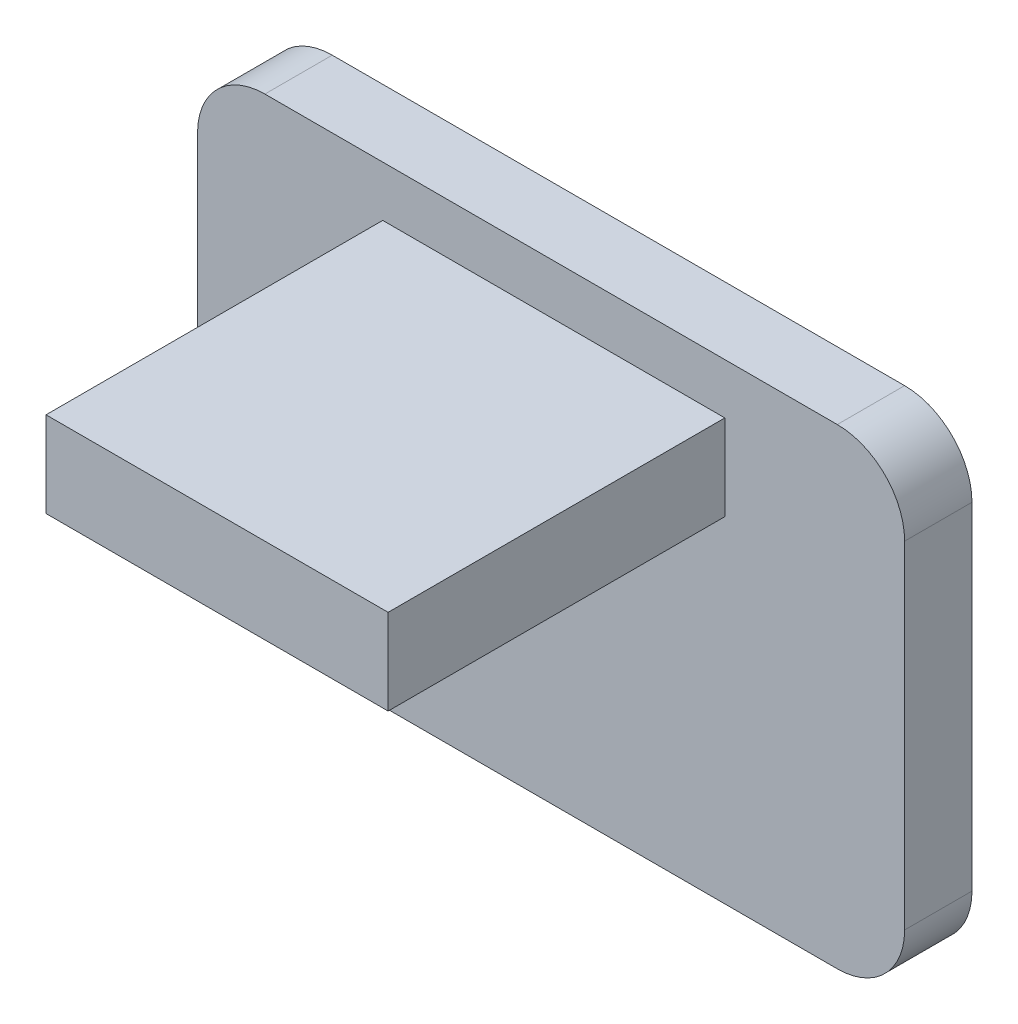
ISO-10303-21;
HEADER;
FILE_DESCRIPTION(('STEP AP214'),'2;1');
FILE_NAME('part.step','',(''),(''),'','','');
FILE_SCHEMA(('AUTOMOTIVE_DESIGN { 1 0 10303 214 1 1 1 1 }'));
ENDSEC;
DATA;
#1=APPLICATION_CONTEXT('core data for automotive mechanical design processes');
#2=APPLICATION_PROTOCOL_DEFINITION('international standard','automotive_design',2000,#1);
#3=PRODUCT_CONTEXT('',#1,'mechanical');
#4=PRODUCT('Part','Part','',(#3));
#5=PRODUCT_RELATED_PRODUCT_CATEGORY('part','',(#4));
#6=PRODUCT_DEFINITION_FORMATION('','',#4);
#7=PRODUCT_DEFINITION_CONTEXT('part definition',#1,'design');
#8=PRODUCT_DEFINITION('design','',#6,#7);
#9=PRODUCT_DEFINITION_SHAPE('','',#8);
#10=(LENGTH_UNIT() NAMED_UNIT(*) SI_UNIT(.MILLI.,.METRE.));
#11=(NAMED_UNIT(*) PLANE_ANGLE_UNIT() SI_UNIT($,.RADIAN.));
#12=(NAMED_UNIT(*) SI_UNIT($,.STERADIAN.) SOLID_ANGLE_UNIT());
#13=UNCERTAINTY_MEASURE_WITH_UNIT(LENGTH_MEASURE(1.E-05),#10,'distance_accuracy_value','');
#14=(GEOMETRIC_REPRESENTATION_CONTEXT(3) GLOBAL_UNCERTAINTY_ASSIGNED_CONTEXT((#13)) GLOBAL_UNIT_ASSIGNED_CONTEXT((#10,
#11,#12)) REPRESENTATION_CONTEXT('',''));
#15=CARTESIAN_POINT('',(0.,0.,0.));
#16=DIRECTION('',(0.,0.,1.));
#17=DIRECTION('',(1.,0.,0.));
#18=AXIS2_PLACEMENT_3D('',#15,#16,#17);
#19=CARTESIAN_POINT('',(-8.93231964354147,9.49408284023669,2.));
#20=DIRECTION('',(0.,0.,1.));
#21=DIRECTION('',(1.,0.,0.));
#22=AXIS2_PLACEMENT_3D('',#19,#20,#21);
#23=PLANE('',#22);
#24=CARTESIAN_POINT('',(-8.93231964354147,9.49408284023669,2.));
#25=DIRECTION('',(0.,0.,1.));
#26=DIRECTION('',(1.,0.,0.));
#27=AXIS2_PLACEMENT_3D('',#24,#25,#26);
#28=CIRCLE('',#27,2.);
#29=CARTESIAN_POINT('',(-8.93231964354145,11.4940828402367,2.));
#30=VERTEX_POINT('',#29);
#31=CARTESIAN_POINT('',(-10.9323196435415,9.49408284023667,2.));
#32=VERTEX_POINT('',#31);
#33=EDGE_CURVE('E191',#30,#32,#28,.T.);
#34=ORIENTED_EDGE('',*,*,#33,.T.);
#35=DIRECTION('',(0.,-1.,0.));
#36=VECTOR('',#35,1.);
#37=CARTESIAN_POINT('',(-10.9323196435415,9.49408284023667,2.));
#38=LINE('',#37,#36);
#39=CARTESIAN_POINT('',(-10.9323196435415,-0.5059171597633,2.));
#40=VERTEX_POINT('',#39);
#41=EDGE_CURVE('E114',#32,#40,#38,.T.);
#42=ORIENTED_EDGE('',*,*,#41,.T.);
#43=CARTESIAN_POINT('',(-8.93231964354147,-0.505917159763313,2.));
#44=DIRECTION('',(0.,0.,1.));
#45=DIRECTION('',(1.,0.,0.));
#46=AXIS2_PLACEMENT_3D('',#43,#44,#45);
#47=CIRCLE('',#46,2.);
#48=CARTESIAN_POINT('',(-8.93231964354145,-2.50591715976331,2.));
#49=VERTEX_POINT('',#48);
#50=EDGE_CURVE('E207',#40,#49,#47,.T.);
#51=ORIENTED_EDGE('',*,*,#50,.T.);
#52=DIRECTION('',(1.,0.,0.));
#53=VECTOR('',#52,1.);
#54=CARTESIAN_POINT('',(-8.93231964354145,-2.50591715976331,2.));
#55=LINE('',#54,#53);
#56=CARTESIAN_POINT('',(8.06768035645852,-2.50591715976331,2.));
#57=VERTEX_POINT('',#56);
#58=EDGE_CURVE('E219',#49,#57,#55,.T.);
#59=ORIENTED_EDGE('',*,*,#58,.T.);
#60=CARTESIAN_POINT('',(8.06768035645854,-0.505917159763314,2.));
#61=DIRECTION('',(0.,0.,1.));
#62=DIRECTION('',(1.,0.,0.));
#63=AXIS2_PLACEMENT_3D('',#60,#61,#62);
#64=CIRCLE('',#63,2.);
#65=CARTESIAN_POINT('',(10.0676803564585,-0.505917159763299,2.));
#66=VERTEX_POINT('',#65);
#67=EDGE_CURVE('E154',#57,#66,#64,.T.);
#68=ORIENTED_EDGE('',*,*,#67,.T.);
#69=DIRECTION('',(0.,-1.,0.));
#70=VECTOR('',#69,1.);
#71=CARTESIAN_POINT('',(10.0676803564585,9.49408284023667,2.));
#72=LINE('',#71,#70);
#73=CARTESIAN_POINT('',(10.0676803564585,9.49408284023667,2.));
#74=VERTEX_POINT('',#73);
#75=EDGE_CURVE('E137',#74,#66,#72,.T.);
#76=ORIENTED_EDGE('',*,*,#75,.F.);
#77=CARTESIAN_POINT('',(8.06768035645853,9.49408284023669,2.));
#78=DIRECTION('',(0.,0.,-1.));
#79=DIRECTION('',(-1.,0.,0.));
#80=AXIS2_PLACEMENT_3D('',#77,#78,#79);
#81=CIRCLE('',#80,2.);
#82=CARTESIAN_POINT('',(8.06768035645852,11.4940828402367,2.));
#83=VERTEX_POINT('',#82);
#84=EDGE_CURVE('E152',#83,#74,#81,.T.);
#85=ORIENTED_EDGE('',*,*,#84,.F.);
#86=DIRECTION('',(1.,0.,0.));
#87=VECTOR('',#86,1.);
#88=CARTESIAN_POINT('',(-8.93231964354145,11.4940828402367,2.));
#89=LINE('',#88,#87);
#90=EDGE_CURVE('E160',#30,#83,#89,.T.);
#91=ORIENTED_EDGE('',*,*,#90,.F.);
#92=EDGE_LOOP('',(#34,#42,#51,#59,#68,#76,#85,#91));
#93=FACE_BOUND('',#92,.T.);
#94=DIRECTION('',(1.,0.,0.));
#95=VECTOR('',#94,1.);
#96=CARTESIAN_POINT('',(-5.43231964354147,7.45408284023669,2.));
#97=LINE('',#96,#95);
#98=CARTESIAN_POINT('',(-5.43231964354147,7.45408284023669,2.));
#99=VERTEX_POINT('',#98);
#100=CARTESIAN_POINT('',(4.72768035645854,7.45408284023669,2.));
#101=VERTEX_POINT('',#100);
#102=EDGE_CURVE('E249',#99,#101,#97,.T.);
#103=ORIENTED_EDGE('',*,*,#102,.F.);
#104=DIRECTION('',(0.,-1.,0.));
#105=VECTOR('',#104,1.);
#106=CARTESIAN_POINT('',(-5.43231964354146,9.99408284023669,2.));
#107=LINE('',#106,#105);
#108=CARTESIAN_POINT('',(-5.43231964354146,9.99408284023669,2.));
#109=VERTEX_POINT('',#108);
#110=EDGE_CURVE('E253',#109,#99,#107,.T.);
#111=ORIENTED_EDGE('',*,*,#110,.F.);
#112=DIRECTION('',(-1.,0.,0.));
#113=VECTOR('',#112,1.);
#114=CARTESIAN_POINT('',(-5.43231964354146,9.99408284023669,2.));
#115=LINE('',#114,#113);
#116=CARTESIAN_POINT('',(4.72768035645854,9.99408284023669,2.));
#117=VERTEX_POINT('',#116);
#118=EDGE_CURVE('E243',#117,#109,#115,.T.);
#119=ORIENTED_EDGE('',*,*,#118,.F.);
#120=DIRECTION('',(0.,1.,0.));
#121=VECTOR('',#120,1.);
#122=CARTESIAN_POINT('',(4.72768035645854,9.99408284023669,2.));
#123=LINE('',#122,#121);
#124=EDGE_CURVE('E247',#101,#117,#123,.T.);
#125=ORIENTED_EDGE('',*,*,#124,.F.);
#126=EDGE_LOOP('',(#103,#111,#119,#125));
#127=FACE_BOUND('',#126,.T.);
#128=ADVANCED_FACE('F40',(#93,#127),#23,.T.);
#129=CARTESIAN_POINT('',(-8.93231964354147,9.49408284023669,2.));
#130=DIRECTION('',(0.,0.,-1.));
#131=DIRECTION('',(-1.,0.,0.));
#132=AXIS2_PLACEMENT_3D('',#129,#130,#131);
#133=CYLINDRICAL_SURFACE('',#132,2.);
#134=CARTESIAN_POINT('',(-8.93231964354147,9.49408284023669,0.));
#135=DIRECTION('',(0.,0.,1.));
#136=DIRECTION('',(1.,0.,0.));
#137=AXIS2_PLACEMENT_3D('',#134,#135,#136);
#138=CIRCLE('',#137,2.);
#139=CARTESIAN_POINT('',(-8.93231964354145,11.4940828402367,0.));
#140=VERTEX_POINT('',#139);
#141=CARTESIAN_POINT('',(-10.9323196435415,9.49408284023667,0.));
#142=VERTEX_POINT('',#141);
#143=EDGE_CURVE('E167',#140,#142,#138,.T.);
#144=ORIENTED_EDGE('',*,*,#143,.T.);
#145=DIRECTION('',(0.,0.,-1.));
#146=VECTOR('',#145,1.);
#147=CARTESIAN_POINT('',(-10.9323196435415,9.49408284023667,2.));
#148=LINE('',#147,#146);
#149=EDGE_CURVE('E11',#32,#142,#148,.T.);
#150=ORIENTED_EDGE('',*,*,#149,.F.);
#151=ORIENTED_EDGE('',*,*,#33,.F.);
#152=DIRECTION('',(0.,0.,-1.));
#153=VECTOR('',#152,1.);
#154=CARTESIAN_POINT('',(-8.93231964354145,11.4940828402367,2.));
#155=LINE('',#154,#153);
#156=EDGE_CURVE('E71',#30,#140,#155,.T.);
#157=ORIENTED_EDGE('',*,*,#156,.T.);
#158=EDGE_LOOP('',(#144,#150,#151,#157));
#159=FACE_BOUND('',#158,.T.);
#160=ADVANCED_FACE('F42',(#159),#133,.T.);
#161=CARTESIAN_POINT('',(-10.9323196435415,9.49408284023667,2.));
#162=DIRECTION('',(1.,0.,0.));
#163=DIRECTION('',(0.,0.,-1.));
#164=AXIS2_PLACEMENT_3D('',#161,#162,#163);
#165=PLANE('',#164);
#166=DIRECTION('',(0.,-1.,0.));
#167=VECTOR('',#166,1.);
#168=CARTESIAN_POINT('',(-10.9323196435415,9.49408284023667,0.));
#169=LINE('',#168,#167);
#170=CARTESIAN_POINT('',(-10.9323196435415,-0.5059171597633,0.));
#171=VERTEX_POINT('',#170);
#172=EDGE_CURVE('E170',#142,#171,#169,.T.);
#173=ORIENTED_EDGE('',*,*,#172,.T.);
#174=DIRECTION('',(0.,0.,-1.));
#175=VECTOR('',#174,1.);
#176=CARTESIAN_POINT('',(-10.9323196435415,-0.5059171597633,2.));
#177=LINE('',#176,#175);
#178=EDGE_CURVE('E49',#40,#171,#177,.T.);
#179=ORIENTED_EDGE('',*,*,#178,.F.);
#180=ORIENTED_EDGE('',*,*,#41,.F.);
#181=ORIENTED_EDGE('',*,*,#149,.T.);
#182=EDGE_LOOP('',(#173,#179,#180,#181));
#183=FACE_BOUND('',#182,.T.);
#184=ADVANCED_FACE('F317',(#183),#165,.F.);
#185=CARTESIAN_POINT('',(-8.93231964354147,-0.505917159763313,2.));
#186=DIRECTION('',(0.,0.,-1.));
#187=DIRECTION('',(-1.,0.,0.));
#188=AXIS2_PLACEMENT_3D('',#185,#186,#187);
#189=CYLINDRICAL_SURFACE('',#188,2.);
#190=CARTESIAN_POINT('',(-8.93231964354147,-0.505917159763313,0.));
#191=DIRECTION('',(0.,0.,1.));
#192=DIRECTION('',(1.,0.,0.));
#193=AXIS2_PLACEMENT_3D('',#190,#191,#192);
#194=CIRCLE('',#193,2.);
#195=CARTESIAN_POINT('',(-8.93231964354145,-2.50591715976331,0.));
#196=VERTEX_POINT('',#195);
#197=EDGE_CURVE('E174',#171,#196,#194,.T.);
#198=ORIENTED_EDGE('',*,*,#197,.T.);
#199=DIRECTION('',(0.,0.,-1.));
#200=VECTOR('',#199,1.);
#201=CARTESIAN_POINT('',(-8.93231964354145,-2.50591715976331,2.));
#202=LINE('',#201,#200);
#203=EDGE_CURVE('E199',#49,#196,#202,.T.);
#204=ORIENTED_EDGE('',*,*,#203,.F.);
#205=ORIENTED_EDGE('',*,*,#50,.F.);
#206=ORIENTED_EDGE('',*,*,#178,.T.);
#207=EDGE_LOOP('',(#198,#204,#205,#206));
#208=FACE_BOUND('',#207,.T.);
#209=ADVANCED_FACE('F205',(#208),#189,.T.);
#210=CARTESIAN_POINT('',(-8.93231964354145,-2.50591715976331,2.));
#211=DIRECTION('',(0.,1.,0.));
#212=DIRECTION('',(0.,0.,1.));
#213=AXIS2_PLACEMENT_3D('',#210,#211,#212);
#214=PLANE('',#213);
#215=DIRECTION('',(1.,0.,0.));
#216=VECTOR('',#215,1.);
#217=CARTESIAN_POINT('',(-8.93231964354145,-2.50591715976331,0.));
#218=LINE('',#217,#216);
#219=CARTESIAN_POINT('',(8.06768035645852,-2.50591715976331,0.));
#220=VERTEX_POINT('',#219);
#221=EDGE_CURVE('E176',#196,#220,#218,.T.);
#222=ORIENTED_EDGE('',*,*,#221,.T.);
#223=DIRECTION('',(0.,0.,-1.));
#224=VECTOR('',#223,1.);
#225=CARTESIAN_POINT('',(8.06768035645852,-2.50591715976331,2.));
#226=LINE('',#225,#224);
#227=EDGE_CURVE('E196',#57,#220,#226,.T.);
#228=ORIENTED_EDGE('',*,*,#227,.F.);
#229=ORIENTED_EDGE('',*,*,#58,.F.);
#230=ORIENTED_EDGE('',*,*,#203,.T.);
#231=EDGE_LOOP('',(#222,#228,#229,#230));
#232=FACE_BOUND('',#231,.T.);
#233=ADVANCED_FACE('F214',(#232),#214,.F.);
#234=CARTESIAN_POINT('',(8.06768035645854,-0.505917159763314,2.));
#235=DIRECTION('',(0.,0.,-1.));
#236=DIRECTION('',(-1.,0.,0.));
#237=AXIS2_PLACEMENT_3D('',#234,#235,#236);
#238=CYLINDRICAL_SURFACE('',#237,2.);
#239=CARTESIAN_POINT('',(8.06768035645854,-0.505917159763314,0.));
#240=DIRECTION('',(0.,0.,1.));
#241=DIRECTION('',(1.,0.,0.));
#242=AXIS2_PLACEMENT_3D('',#239,#240,#241);
#243=CIRCLE('',#242,2.);
#244=CARTESIAN_POINT('',(10.0676803564585,-0.505917159763299,0.));
#245=VERTEX_POINT('',#244);
#246=EDGE_CURVE('E179',#220,#245,#243,.T.);
#247=ORIENTED_EDGE('',*,*,#246,.T.);
#248=DIRECTION('',(0.,0.,-1.));
#249=VECTOR('',#248,1.);
#250=CARTESIAN_POINT('',(10.0676803564585,-0.505917159763299,2.));
#251=LINE('',#250,#249);
#252=EDGE_CURVE('E145',#66,#245,#251,.T.);
#253=ORIENTED_EDGE('',*,*,#252,.F.);
#254=ORIENTED_EDGE('',*,*,#67,.F.);
#255=ORIENTED_EDGE('',*,*,#227,.T.);
#256=EDGE_LOOP('',(#247,#253,#254,#255));
#257=FACE_BOUND('',#256,.T.);
#258=ADVANCED_FACE('F217',(#257),#238,.T.);
#259=CARTESIAN_POINT('',(10.0676803564585,9.49408284023667,2.));
#260=DIRECTION('',(1.,0.,0.));
#261=DIRECTION('',(0.,1.,0.));
#262=AXIS2_PLACEMENT_3D('',#259,#260,#261);
#263=PLANE('',#262);
#264=DIRECTION('',(0.,-1.,0.));
#265=VECTOR('',#264,1.);
#266=CARTESIAN_POINT('',(10.0676803564585,9.49408284023667,0.));
#267=LINE('',#266,#265);
#268=CARTESIAN_POINT('',(10.0676803564585,9.49408284023667,0.));
#269=VERTEX_POINT('',#268);
#270=EDGE_CURVE('E139',#269,#245,#267,.T.);
#271=ORIENTED_EDGE('',*,*,#270,.F.);
#272=DIRECTION('',(0.,0.,-1.));
#273=VECTOR('',#272,1.);
#274=CARTESIAN_POINT('',(10.0676803564585,9.49408284023667,2.));
#275=LINE('',#274,#273);
#276=EDGE_CURVE('E134',#74,#269,#275,.T.);
#277=ORIENTED_EDGE('',*,*,#276,.F.);
#278=ORIENTED_EDGE('',*,*,#75,.T.);
#279=ORIENTED_EDGE('',*,*,#252,.T.);
#280=EDGE_LOOP('',(#271,#277,#278,#279));
#281=FACE_BOUND('',#280,.T.);
#282=ADVANCED_FACE('F136',(#281),#263,.T.);
#283=CARTESIAN_POINT('',(8.06768035645853,9.49408284023669,2.));
#284=DIRECTION('',(0.,0.,-1.));
#285=DIRECTION('',(-1.,0.,0.));
#286=AXIS2_PLACEMENT_3D('',#283,#284,#285);
#287=CYLINDRICAL_SURFACE('',#286,2.);
#288=CARTESIAN_POINT('',(8.06768035645853,9.49408284023669,0.));
#289=DIRECTION('',(0.,0.,-1.));
#290=DIRECTION('',(-1.,0.,0.));
#291=AXIS2_PLACEMENT_3D('',#288,#289,#290);
#292=CIRCLE('',#291,2.);
#293=CARTESIAN_POINT('',(8.06768035645852,11.4940828402367,0.));
#294=VERTEX_POINT('',#293);
#295=EDGE_CURVE('E184',#294,#269,#292,.T.);
#296=ORIENTED_EDGE('',*,*,#295,.F.);
#297=DIRECTION('',(0.,0.,-1.));
#298=VECTOR('',#297,1.);
#299=CARTESIAN_POINT('',(8.06768035645852,11.4940828402367,2.));
#300=LINE('',#299,#298);
#301=EDGE_CURVE('E146',#83,#294,#300,.T.);
#302=ORIENTED_EDGE('',*,*,#301,.F.);
#303=ORIENTED_EDGE('',*,*,#84,.T.);
#304=ORIENTED_EDGE('',*,*,#276,.T.);
#305=EDGE_LOOP('',(#296,#302,#303,#304));
#306=FACE_BOUND('',#305,.T.);
#307=ADVANCED_FACE('F158',(#306),#287,.T.);
#308=CARTESIAN_POINT('',(-8.93231964354145,11.4940828402367,2.));
#309=DIRECTION('',(0.,1.,0.));
#310=DIRECTION('',(0.,0.,1.));
#311=AXIS2_PLACEMENT_3D('',#308,#309,#310);
#312=PLANE('',#311);
#313=DIRECTION('',(1.,0.,0.));
#314=VECTOR('',#313,1.);
#315=CARTESIAN_POINT('',(-8.93231964354145,11.4940828402367,0.));
#316=LINE('',#315,#314);
#317=EDGE_CURVE('E187',#140,#294,#316,.T.);
#318=ORIENTED_EDGE('',*,*,#317,.F.);
#319=ORIENTED_EDGE('',*,*,#156,.F.);
#320=ORIENTED_EDGE('',*,*,#90,.T.);
#321=ORIENTED_EDGE('',*,*,#301,.T.);
#322=EDGE_LOOP('',(#318,#319,#320,#321));
#323=FACE_BOUND('',#322,.T.);
#324=ADVANCED_FACE('F322',(#323),#312,.T.);
#325=CARTESIAN_POINT('',(-8.93231964354147,9.49408284023669,0.));
#326=DIRECTION('',(0.,0.,1.));
#327=DIRECTION('',(1.,0.,0.));
#328=AXIS2_PLACEMENT_3D('',#325,#326,#327);
#329=PLANE('',#328);
#330=ORIENTED_EDGE('',*,*,#143,.F.);
#331=ORIENTED_EDGE('',*,*,#317,.T.);
#332=ORIENTED_EDGE('',*,*,#295,.T.);
#333=ORIENTED_EDGE('',*,*,#270,.T.);
#334=ORIENTED_EDGE('',*,*,#246,.F.);
#335=ORIENTED_EDGE('',*,*,#221,.F.);
#336=ORIENTED_EDGE('',*,*,#197,.F.);
#337=ORIENTED_EDGE('',*,*,#172,.F.);
#338=EDGE_LOOP('',(#330,#331,#332,#333,#334,#335,#336,#337));
#339=FACE_BOUND('',#338,.T.);
#340=ADVANCED_FACE('F210',(#339),#329,.F.);
#341=CARTESIAN_POINT('',(-5.43231964354146,9.99408284023669,12.));
#342=DIRECTION('',(1.,0.,0.));
#343=DIRECTION('',(0.,1.,0.));
#344=AXIS2_PLACEMENT_3D('',#341,#342,#343);
#345=PLANE('',#344);
#346=ORIENTED_EDGE('',*,*,#110,.T.);
#347=DIRECTION('',(0.,0.,-1.));
#348=VECTOR('',#347,1.);
#349=CARTESIAN_POINT('',(-5.43231964354147,7.45408284023669,12.));
#350=LINE('',#349,#348);
#351=CARTESIAN_POINT('',(-5.43231964354147,7.45408284023669,12.));
#352=VERTEX_POINT('',#351);
#353=EDGE_CURVE('E171',#352,#99,#350,.T.);
#354=ORIENTED_EDGE('',*,*,#353,.F.);
#355=DIRECTION('',(0.,-1.,0.));
#356=VECTOR('',#355,1.);
#357=CARTESIAN_POINT('',(-5.43231964354146,9.99408284023669,12.));
#358=LINE('',#357,#356);
#359=CARTESIAN_POINT('',(-5.43231964354146,9.99408284023669,12.));
#360=VERTEX_POINT('',#359);
#361=EDGE_CURVE('E246',#360,#352,#358,.T.);
#362=ORIENTED_EDGE('',*,*,#361,.F.);
#363=DIRECTION('',(0.,0.,-1.));
#364=VECTOR('',#363,1.);
#365=CARTESIAN_POINT('',(-5.43231964354146,9.99408284023669,12.));
#366=LINE('',#365,#364);
#367=EDGE_CURVE('E238',#360,#109,#366,.T.);
#368=ORIENTED_EDGE('',*,*,#367,.T.);
#369=EDGE_LOOP('',(#346,#354,#362,#368));
#370=FACE_BOUND('',#369,.T.);
#371=ADVANCED_FACE('F282',(#370),#345,.F.);
#372=CARTESIAN_POINT('',(-5.43231964354147,7.45408284023669,12.));
#373=DIRECTION('',(0.,1.,0.));
#374=DIRECTION('',(0.,0.,1.));
#375=AXIS2_PLACEMENT_3D('',#372,#373,#374);
#376=PLANE('',#375);
#377=ORIENTED_EDGE('',*,*,#102,.T.);
#378=DIRECTION('',(0.,0.,-1.));
#379=VECTOR('',#378,1.);
#380=CARTESIAN_POINT('',(4.72768035645854,7.45408284023669,12.));
#381=LINE('',#380,#379);
#382=CARTESIAN_POINT('',(4.72768035645854,7.45408284023669,12.));
#383=VERTEX_POINT('',#382);
#384=EDGE_CURVE('E232',#383,#101,#381,.T.);
#385=ORIENTED_EDGE('',*,*,#384,.F.);
#386=DIRECTION('',(1.,0.,0.));
#387=VECTOR('',#386,1.);
#388=CARTESIAN_POINT('',(-5.43231964354147,7.45408284023669,12.));
#389=LINE('',#388,#387);
#390=EDGE_CURVE('E264',#352,#383,#389,.T.);
#391=ORIENTED_EDGE('',*,*,#390,.F.);
#392=ORIENTED_EDGE('',*,*,#353,.T.);
#393=EDGE_LOOP('',(#377,#385,#391,#392));
#394=FACE_BOUND('',#393,.T.);
#395=ADVANCED_FACE('F287',(#394),#376,.F.);
#396=CARTESIAN_POINT('',(4.72768035645854,9.99408284023669,12.));
#397=DIRECTION('',(-1.,0.,0.));
#398=DIRECTION('',(0.,0.,1.));
#399=AXIS2_PLACEMENT_3D('',#396,#397,#398);
#400=PLANE('',#399);
#401=ORIENTED_EDGE('',*,*,#124,.T.);
#402=DIRECTION('',(0.,0.,-1.));
#403=VECTOR('',#402,1.);
#404=CARTESIAN_POINT('',(4.72768035645854,9.99408284023669,12.));
#405=LINE('',#404,#403);
#406=CARTESIAN_POINT('',(4.72768035645854,9.99408284023669,12.));
#407=VERTEX_POINT('',#406);
#408=EDGE_CURVE('E59',#407,#117,#405,.T.);
#409=ORIENTED_EDGE('',*,*,#408,.F.);
#410=DIRECTION('',(0.,1.,0.));
#411=VECTOR('',#410,1.);
#412=CARTESIAN_POINT('',(4.72768035645854,9.99408284023669,12.));
#413=LINE('',#412,#411);
#414=EDGE_CURVE('E260',#383,#407,#413,.T.);
#415=ORIENTED_EDGE('',*,*,#414,.F.);
#416=ORIENTED_EDGE('',*,*,#384,.T.);
#417=EDGE_LOOP('',(#401,#409,#415,#416));
#418=FACE_BOUND('',#417,.T.);
#419=ADVANCED_FACE('F302',(#418),#400,.F.);
#420=CARTESIAN_POINT('',(-5.43231964354146,9.99408284023669,12.));
#421=DIRECTION('',(0.,-1.,0.));
#422=DIRECTION('',(0.,0.,-1.));
#423=AXIS2_PLACEMENT_3D('',#420,#421,#422);
#424=PLANE('',#423);
#425=ORIENTED_EDGE('',*,*,#118,.T.);
#426=ORIENTED_EDGE('',*,*,#367,.F.);
#427=DIRECTION('',(-1.,0.,0.));
#428=VECTOR('',#427,1.);
#429=CARTESIAN_POINT('',(-5.43231964354146,9.99408284023669,12.));
#430=LINE('',#429,#428);
#431=EDGE_CURVE('E242',#407,#360,#430,.T.);
#432=ORIENTED_EDGE('',*,*,#431,.F.);
#433=ORIENTED_EDGE('',*,*,#408,.T.);
#434=EDGE_LOOP('',(#425,#426,#432,#433));
#435=FACE_BOUND('',#434,.T.);
#436=ADVANCED_FACE('F299',(#435),#424,.F.);
#437=CARTESIAN_POINT('',(0.,0.,12.));
#438=DIRECTION('',(0.,0.,1.));
#439=DIRECTION('',(1.,0.,0.));
#440=AXIS2_PLACEMENT_3D('',#437,#438,#439);
#441=PLANE('',#440);
#442=ORIENTED_EDGE('',*,*,#361,.T.);
#443=ORIENTED_EDGE('',*,*,#390,.T.);
#444=ORIENTED_EDGE('',*,*,#414,.T.);
#445=ORIENTED_EDGE('',*,*,#431,.T.);
#446=EDGE_LOOP('',(#442,#443,#444,#445));
#447=FACE_BOUND('',#446,.T.);
#448=ADVANCED_FACE('F274',(#447),#441,.T.);
#449=CLOSED_SHELL('',(#128,#160,#184,#209,#233,#258,#282,#307,#324,#340,#371,#395,#419,#436,#448));
#450=MANIFOLD_SOLID_BREP('B2',#449);
#451=ADVANCED_BREP_SHAPE_REPRESENTATION('',(#18,#450),#14);
#452=SHAPE_DEFINITION_REPRESENTATION(#9,#451);
ENDSEC;
END-ISO-10303-21;
